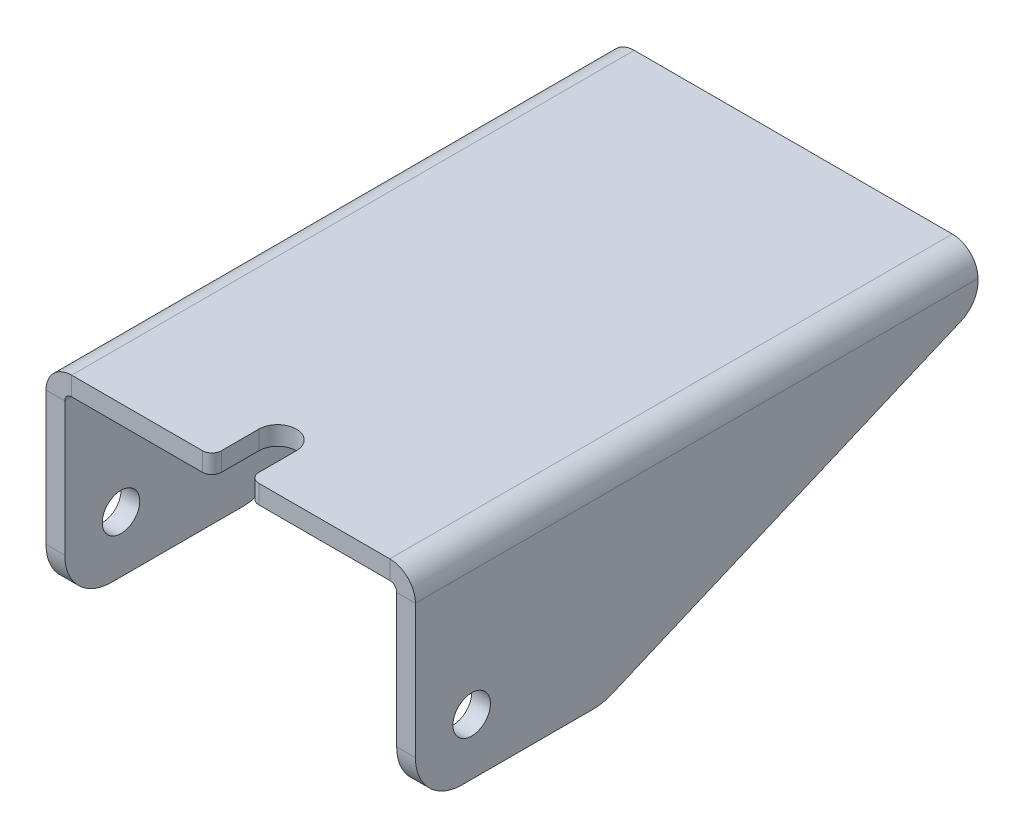
ISO-10303-21;
HEADER;
FILE_DESCRIPTION(('STEP AP214'),'2;1');
FILE_NAME('part.step','',(''),(''),'','','');
FILE_SCHEMA(('AUTOMOTIVE_DESIGN { 1 0 10303 214 1 1 1 1 }'));
ENDSEC;
DATA;
#1=APPLICATION_CONTEXT('core data for automotive mechanical design processes');
#2=APPLICATION_PROTOCOL_DEFINITION('international standard','automotive_design',2000,#1);
#3=PRODUCT_CONTEXT('',#1,'mechanical');
#4=PRODUCT('Part','Part','',(#3));
#5=PRODUCT_RELATED_PRODUCT_CATEGORY('part','',(#4));
#6=PRODUCT_DEFINITION_FORMATION('','',#4);
#7=PRODUCT_DEFINITION_CONTEXT('part definition',#1,'design');
#8=PRODUCT_DEFINITION('design','',#6,#7);
#9=PRODUCT_DEFINITION_SHAPE('','',#8);
#10=(LENGTH_UNIT() NAMED_UNIT(*) SI_UNIT(.MILLI.,.METRE.));
#11=(NAMED_UNIT(*) PLANE_ANGLE_UNIT() SI_UNIT($,.RADIAN.));
#12=(NAMED_UNIT(*) SI_UNIT($,.STERADIAN.) SOLID_ANGLE_UNIT());
#13=UNCERTAINTY_MEASURE_WITH_UNIT(LENGTH_MEASURE(1.E-05),#10,'distance_accuracy_value','');
#14=(GEOMETRIC_REPRESENTATION_CONTEXT(3) GLOBAL_UNCERTAINTY_ASSIGNED_CONTEXT((#13)) GLOBAL_UNIT_ASSIGNED_CONTEXT((#10,
#11,#12)) REPRESENTATION_CONTEXT('',''));
#15=CARTESIAN_POINT('',(0.,0.,0.));
#16=DIRECTION('',(0.,0.,1.));
#17=DIRECTION('',(1.,0.,0.));
#18=AXIS2_PLACEMENT_3D('',#15,#16,#17);
#19=CARTESIAN_POINT('',(-17.7,-2.,60.));
#20=DIRECTION('',(0.,0.,1.));
#21=DIRECTION('',(1.,0.,0.));
#22=AXIS2_PLACEMENT_3D('',#19,#20,#21);
#23=PLANE('',#22);
#24=DIRECTION('',(1.,0.,0.));
#25=VECTOR('',#24,1.);
#26=CARTESIAN_POINT('',(-17.7,0.,60.));
#27=LINE('',#26,#25);
#28=CARTESIAN_POINT('',(2.99999999999999,0.,60.));
#29=VERTEX_POINT('',#28);
#30=CARTESIAN_POINT('',(16.9634,0.,60.));
#31=VERTEX_POINT('',#30);
#32=EDGE_CURVE('E480',#29,#31,#27,.T.);
#33=ORIENTED_EDGE('',*,*,#32,.F.);
#34=DIRECTION('',(0.,1.,0.));
#35=VECTOR('',#34,1.);
#36=CARTESIAN_POINT('',(2.99999999999999,-2.,60.));
#37=LINE('',#36,#35);
#38=CARTESIAN_POINT('',(2.99999999999999,-2.,60.));
#39=VERTEX_POINT('',#38);
#40=EDGE_CURVE('E11',#29,#39,#37,.F.);
#41=ORIENTED_EDGE('',*,*,#40,.T.);
#42=DIRECTION('',(1.,0.,0.));
#43=VECTOR('',#42,1.);
#44=CARTESIAN_POINT('',(-17.7,-2.,60.));
#45=LINE('',#44,#43);
#46=CARTESIAN_POINT('',(16.9634,-2.,60.));
#47=VERTEX_POINT('',#46);
#48=EDGE_CURVE('E470',#39,#47,#45,.T.);
#49=ORIENTED_EDGE('',*,*,#48,.T.);
#50=DIRECTION('',(0.,1.,0.));
#51=VECTOR('',#50,1.);
#52=CARTESIAN_POINT('',(16.9634,-2.,60.));
#53=LINE('',#52,#51);
#54=EDGE_CURVE('E334',#47,#31,#53,.T.);
#55=ORIENTED_EDGE('',*,*,#54,.T.);
#56=EDGE_LOOP('',(#33,#41,#49,#55));
#57=FACE_BOUND('',#56,.T.);
#58=ADVANCED_FACE('F43',(#57),#23,.T.);
#59=CARTESIAN_POINT('',(-19.7000000000001,-22.,0.));
#60=DIRECTION('',(0.,0.,1.));
#61=DIRECTION('',(1.,0.,0.));
#62=AXIS2_PLACEMENT_3D('',#59,#60,#61);
#63=PLANE('',#62);
#64=DIRECTION('',(0.,-1.,0.));
#65=VECTOR('',#64,1.);
#66=CARTESIAN_POINT('',(-17.7000000000001,-22.,0.));
#67=LINE('',#66,#65);
#68=CARTESIAN_POINT('',(-17.7,-2.7366,0.));
#69=VERTEX_POINT('',#68);
#70=CARTESIAN_POINT('',(-17.7,-3.01530292818484,0.));
#71=VERTEX_POINT('',#70);
#72=EDGE_CURVE('E412',#69,#71,#67,.T.);
#73=ORIENTED_EDGE('',*,*,#72,.T.);
#74=DIRECTION('',(-1.,0.,0.));
#75=VECTOR('',#74,1.);
#76=CARTESIAN_POINT('',(-19.7,-3.01530292818483,0.));
#77=LINE('',#76,#75);
#78=CARTESIAN_POINT('',(-19.7,-3.01530292818483,0.));
#79=VERTEX_POINT('',#78);
#80=EDGE_CURVE('E509',#71,#79,#77,.T.);
#81=ORIENTED_EDGE('',*,*,#80,.T.);
#82=DIRECTION('',(0.,-1.,0.));
#83=VECTOR('',#82,1.);
#84=CARTESIAN_POINT('',(-19.7000000000001,-22.,0.));
#85=LINE('',#84,#83);
#86=CARTESIAN_POINT('',(-19.7,-2.73659999999999,0.));
#87=VERTEX_POINT('',#86);
#88=EDGE_CURVE('E413',#87,#79,#85,.T.);
#89=ORIENTED_EDGE('',*,*,#88,.F.);
#90=DIRECTION('',(-1.,0.,0.));
#91=VECTOR('',#90,1.);
#92=CARTESIAN_POINT('',(-17.7,-2.7366,0.));
#93=LINE('',#92,#91);
#94=EDGE_CURVE('E401',#69,#87,#93,.T.);
#95=ORIENTED_EDGE('',*,*,#94,.F.);
#96=EDGE_LOOP('',(#73,#81,#89,#95));
#97=FACE_BOUND('',#96,.T.);
#98=ADVANCED_FACE('F555',(#97),#63,.F.);
#99=CARTESIAN_POINT('',(-19.7,0.,0.));
#100=DIRECTION('',(1.,0.,0.));
#101=DIRECTION('',(0.,1.,0.));
#102=AXIS2_PLACEMENT_3D('',#99,#100,#101);
#103=PLANE('',#102);
#104=CARTESIAN_POINT('',(-19.7,-16.,54.));
#105=DIRECTION('',(-1.,0.,0.));
#106=DIRECTION('',(0.,-1.,0.));
#107=AXIS2_PLACEMENT_3D('',#104,#105,#106);
#108=CIRCLE('',#107,2.);
#109=CARTESIAN_POINT('',(-19.7000000000001,-18.,54.));
#110=VERTEX_POINT('',#109);
#111=EDGE_CURVE('E383',#110,#110,#108,.T.);
#112=ORIENTED_EDGE('',*,*,#111,.F.);
#113=EDGE_LOOP('',(#112));
#114=FACE_BOUND('',#113,.T.);
#115=ORIENTED_EDGE('',*,*,#88,.T.);
#116=CARTESIAN_POINT('',(-19.7,-3.01530292818483,3.));
#117=DIRECTION('',(1.,0.,0.));
#118=DIRECTION('',(0.,1.,0.));
#119=AXIS2_PLACEMENT_3D('',#116,#117,#118);
#120=CIRCLE('',#119,3.);
#121=CARTESIAN_POINT('',(-19.7,-5.77629568356025,1.82657807896545));
#122=VERTEX_POINT('',#121);
#123=EDGE_CURVE('E513',#79,#122,#120,.F.);
#124=ORIENTED_EDGE('',*,*,#123,.T.);
#125=DIRECTION('',(0.,-0.391140640344853,0.920330918458474));
#126=VECTOR('',#125,1.);
#127=CARTESIAN_POINT('',(-19.7,-4.99999999999993,0.));
#128=LINE('',#127,#126);
#129=CARTESIAN_POINT('',(-19.7000000000001,-21.6016545922924,39.0627166877468));
#130=VERTEX_POINT('',#129);
#131=EDGE_CURVE('E391',#122,#130,#128,.T.);
#132=ORIENTED_EDGE('',*,*,#131,.T.);
#133=CARTESIAN_POINT('',(-19.7000000000001,-17.,41.018419889471));
#134=DIRECTION('',(1.,0.,0.));
#135=DIRECTION('',(0.,1.,0.));
#136=AXIS2_PLACEMENT_3D('',#133,#134,#135);
#137=CIRCLE('',#136,5.);
#138=CARTESIAN_POINT('',(-19.7000000000001,-22.,41.018419889471));
#139=VERTEX_POINT('',#138);
#140=EDGE_CURVE('E489',#130,#139,#137,.F.);
#141=ORIENTED_EDGE('',*,*,#140,.T.);
#142=DIRECTION('',(0.,0.,1.));
#143=VECTOR('',#142,1.);
#144=CARTESIAN_POINT('',(-19.7000000000001,-22.,60.));
#145=LINE('',#144,#143);
#146=CARTESIAN_POINT('',(-19.7000000000001,-22.,55.));
#147=VERTEX_POINT('',#146);
#148=EDGE_CURVE('E417',#139,#147,#145,.T.);
#149=ORIENTED_EDGE('',*,*,#148,.T.);
#150=CARTESIAN_POINT('',(-19.7,-17.,55.));
#151=DIRECTION('',(1.,0.,0.));
#152=DIRECTION('',(0.,1.,0.));
#153=AXIS2_PLACEMENT_3D('',#150,#151,#152);
#154=CIRCLE('',#153,5.);
#155=CARTESIAN_POINT('',(-19.7,-17.,60.));
#156=VERTEX_POINT('',#155);
#157=EDGE_CURVE('E486',#147,#156,#154,.F.);
#158=ORIENTED_EDGE('',*,*,#157,.T.);
#159=DIRECTION('',(0.,1.,0.));
#160=VECTOR('',#159,1.);
#161=CARTESIAN_POINT('',(-19.7,-1.99999999999999,60.));
#162=LINE('',#161,#160);
#163=CARTESIAN_POINT('',(-19.7,-2.73659999999999,60.));
#164=VERTEX_POINT('',#163);
#165=EDGE_CURVE('E422',#156,#164,#162,.T.);
#166=ORIENTED_EDGE('',*,*,#165,.T.);
#167=DIRECTION('',(0.,0.,1.));
#168=VECTOR('',#167,1.);
#169=CARTESIAN_POINT('',(-19.7,-2.73659999999999,0.));
#170=LINE('',#169,#168);
#171=EDGE_CURVE('E405',#87,#164,#170,.T.);
#172=ORIENTED_EDGE('',*,*,#171,.F.);
#173=EDGE_LOOP('',(#115,#124,#132,#141,#149,#158,#166,#172));
#174=FACE_BOUND('',#173,.T.);
#175=ADVANCED_FACE('F561',(#114,#174),#103,.F.);
#176=CARTESIAN_POINT('',(-17.7,0.,0.));
#177=DIRECTION('',(1.,0.,0.));
#178=DIRECTION('',(0.,1.,0.));
#179=AXIS2_PLACEMENT_3D('',#176,#177,#178);
#180=PLANE('',#179);
#181=CARTESIAN_POINT('',(-17.7,-16.,54.));
#182=DIRECTION('',(1.,0.,0.));
#183=DIRECTION('',(0.,1.,0.));
#184=AXIS2_PLACEMENT_3D('',#181,#182,#183);
#185=CIRCLE('',#184,2.);
#186=CARTESIAN_POINT('',(-17.7,-14.,54.));
#187=VERTEX_POINT('',#186);
#188=EDGE_CURVE('E387',#187,#187,#185,.F.);
#189=ORIENTED_EDGE('',*,*,#188,.T.);
#190=EDGE_LOOP('',(#189));
#191=FACE_BOUND('',#190,.T.);
#192=DIRECTION('',(0.,-0.391140640344853,0.920330918458474));
#193=VECTOR('',#192,1.);
#194=CARTESIAN_POINT('',(-17.7,-4.99999999999994,0.));
#195=LINE('',#194,#193);
#196=CARTESIAN_POINT('',(-17.7,-5.77629568356026,1.82657807896545));
#197=VERTEX_POINT('',#196);
#198=CARTESIAN_POINT('',(-17.7000000000001,-21.6016545922924,39.0627166877468));
#199=VERTEX_POINT('',#198);
#200=EDGE_CURVE('E394',#197,#199,#195,.T.);
#201=ORIENTED_EDGE('',*,*,#200,.F.);
#202=CARTESIAN_POINT('',(-17.7,-3.01530292818484,3.));
#203=DIRECTION('',(1.,0.,0.));
#204=DIRECTION('',(0.,1.,0.));
#205=AXIS2_PLACEMENT_3D('',#202,#203,#204);
#206=CIRCLE('',#205,3.);
#207=EDGE_CURVE('E519',#197,#71,#206,.T.);
#208=ORIENTED_EDGE('',*,*,#207,.T.);
#209=ORIENTED_EDGE('',*,*,#72,.F.);
#210=DIRECTION('',(0.,0.,-1.));
#211=VECTOR('',#210,1.);
#212=CARTESIAN_POINT('',(-17.7,-2.7366,60.));
#213=LINE('',#212,#211);
#214=CARTESIAN_POINT('',(-17.7,-2.7366,60.));
#215=VERTEX_POINT('',#214);
#216=EDGE_CURVE('E398',#215,#69,#213,.T.);
#217=ORIENTED_EDGE('',*,*,#216,.F.);
#218=DIRECTION('',(0.,1.,0.));
#219=VECTOR('',#218,1.);
#220=CARTESIAN_POINT('',(-17.7,-2.,60.));
#221=LINE('',#220,#219);
#222=CARTESIAN_POINT('',(-17.7,-17.,60.));
#223=VERTEX_POINT('',#222);
#224=EDGE_CURVE('E418',#223,#215,#221,.T.);
#225=ORIENTED_EDGE('',*,*,#224,.F.);
#226=CARTESIAN_POINT('',(-17.7,-17.,55.));
#227=DIRECTION('',(1.,0.,0.));
#228=DIRECTION('',(0.,1.,0.));
#229=AXIS2_PLACEMENT_3D('',#226,#227,#228);
#230=CIRCLE('',#229,5.);
#231=CARTESIAN_POINT('',(-17.7000000000001,-22.,55.));
#232=VERTEX_POINT('',#231);
#233=EDGE_CURVE('E498',#223,#232,#230,.T.);
#234=ORIENTED_EDGE('',*,*,#233,.T.);
#235=DIRECTION('',(0.,0.,1.));
#236=VECTOR('',#235,1.);
#237=CARTESIAN_POINT('',(-17.7000000000001,-22.,60.));
#238=LINE('',#237,#236);
#239=CARTESIAN_POINT('',(-17.7000000000001,-22.,41.018419889471));
#240=VERTEX_POINT('',#239);
#241=EDGE_CURVE('E429',#240,#232,#238,.T.);
#242=ORIENTED_EDGE('',*,*,#241,.F.);
#243=CARTESIAN_POINT('',(-17.7,-17.,41.018419889471));
#244=DIRECTION('',(1.,0.,0.));
#245=DIRECTION('',(0.,1.,0.));
#246=AXIS2_PLACEMENT_3D('',#243,#244,#245);
#247=CIRCLE('',#246,5.);
#248=EDGE_CURVE('E501',#240,#199,#247,.T.);
#249=ORIENTED_EDGE('',*,*,#248,.T.);
#250=EDGE_LOOP('',(#201,#208,#209,#217,#225,#234,#242,#249));
#251=FACE_BOUND('',#250,.T.);
#252=ADVANCED_FACE('F628',(#191,#251),#180,.T.);
#253=CARTESIAN_POINT('',(-19.7000000000001,-22.,60.));
#254=DIRECTION('',(0.,1.,0.));
#255=DIRECTION('',(-1.,0.,0.));
#256=AXIS2_PLACEMENT_3D('',#253,#254,#255);
#257=PLANE('',#256);
#258=ORIENTED_EDGE('',*,*,#148,.F.);
#259=DIRECTION('',(-1.,0.,0.));
#260=VECTOR('',#259,1.);
#261=CARTESIAN_POINT('',(-17.7,-22.,41.018419889471));
#262=LINE('',#261,#260);
#263=EDGE_CURVE('E495',#139,#240,#262,.F.);
#264=ORIENTED_EDGE('',*,*,#263,.T.);
#265=ORIENTED_EDGE('',*,*,#241,.T.);
#266=DIRECTION('',(1.,0.,0.));
#267=VECTOR('',#266,1.);
#268=CARTESIAN_POINT('',(-19.7000000000001,-22.,55.));
#269=LINE('',#268,#267);
#270=EDGE_CURVE('E492',#232,#147,#269,.F.);
#271=ORIENTED_EDGE('',*,*,#270,.T.);
#272=EDGE_LOOP('',(#258,#264,#265,#271));
#273=FACE_BOUND('',#272,.T.);
#274=ADVANCED_FACE('F649',(#273),#257,.F.);
#275=CARTESIAN_POINT('',(0.,-2.,0.));
#276=DIRECTION('',(0.,0.,-1.));
#277=DIRECTION('',(-1.,0.,0.));
#278=AXIS2_PLACEMENT_3D('',#275,#276,#277);
#279=PLANE('',#278);
#280=DIRECTION('',(-1.,0.,0.));
#281=VECTOR('',#280,1.);
#282=CARTESIAN_POINT('',(0.,-2.,0.));
#283=LINE('',#282,#281);
#284=CARTESIAN_POINT('',(16.9634,-2.,0.));
#285=VERTEX_POINT('',#284);
#286=CARTESIAN_POINT('',(-16.9634,-2.,0.));
#287=VERTEX_POINT('',#286);
#288=EDGE_CURVE('E466',#285,#287,#283,.T.);
#289=ORIENTED_EDGE('',*,*,#288,.T.);
#290=DIRECTION('',(0.,1.,0.));
#291=VECTOR('',#290,1.);
#292=CARTESIAN_POINT('',(-16.9634,-2.,0.));
#293=LINE('',#292,#291);
#294=CARTESIAN_POINT('',(-16.9634,0.,0.));
#295=VERTEX_POINT('',#294);
#296=EDGE_CURVE('E444',#287,#295,#293,.T.);
#297=ORIENTED_EDGE('',*,*,#296,.T.);
#298=DIRECTION('',(-1.,0.,0.));
#299=VECTOR('',#298,1.);
#300=CARTESIAN_POINT('',(0.,0.,0.));
#301=LINE('',#300,#299);
#302=CARTESIAN_POINT('',(16.9634,0.,0.));
#303=VERTEX_POINT('',#302);
#304=EDGE_CURVE('E462',#303,#295,#301,.T.);
#305=ORIENTED_EDGE('',*,*,#304,.F.);
#306=DIRECTION('',(0.,1.,0.));
#307=VECTOR('',#306,1.);
#308=CARTESIAN_POINT('',(16.9634,-2.,0.));
#309=LINE('',#308,#307);
#310=EDGE_CURVE('E320',#285,#303,#309,.T.);
#311=ORIENTED_EDGE('',*,*,#310,.F.);
#312=EDGE_LOOP('',(#289,#297,#305,#311));
#313=FACE_BOUND('',#312,.T.);
#314=ADVANCED_FACE('F616',(#313),#279,.T.);
#315=CARTESIAN_POINT('',(0.,-2.,0.));
#316=DIRECTION('',(0.,1.,0.));
#317=DIRECTION('',(0.,0.,1.));
#318=AXIS2_PLACEMENT_3D('',#315,#316,#317);
#319=PLANE('',#318);
#320=DIRECTION('',(0.,0.,-1.));
#321=VECTOR('',#320,1.);
#322=CARTESIAN_POINT('',(-1.99999999999999,-2.,55.));
#323=LINE('',#322,#321);
#324=CARTESIAN_POINT('',(-1.99999999999999,-2.,59.));
#325=VERTEX_POINT('',#324);
#326=CARTESIAN_POINT('',(-1.99999999999999,-2.,55.));
#327=VERTEX_POINT('',#326);
#328=EDGE_CURVE('E224',#325,#327,#323,.T.);
#329=ORIENTED_EDGE('',*,*,#328,.F.);
#330=CARTESIAN_POINT('',(-2.99999999999999,-2.,59.));
#331=DIRECTION('',(0.,1.,0.));
#332=DIRECTION('',(0.,0.,1.));
#333=AXIS2_PLACEMENT_3D('',#330,#331,#332);
#334=CIRCLE('',#333,1.);
#335=CARTESIAN_POINT('',(-2.99999999999999,-2.,60.));
#336=VERTEX_POINT('',#335);
#337=EDGE_CURVE('E536',#325,#336,#334,.F.);
#338=ORIENTED_EDGE('',*,*,#337,.T.);
#339=CARTESIAN_POINT('',(-16.9634,-2.,60.));
#340=VERTEX_POINT('',#339);
#341=EDGE_CURVE('E472',#340,#336,#45,.T.);
#342=ORIENTED_EDGE('',*,*,#341,.F.);
#343=DIRECTION('',(0.,0.,-1.));
#344=VECTOR('',#343,1.);
#345=CARTESIAN_POINT('',(-16.9634,-2.,0.));
#346=LINE('',#345,#344);
#347=EDGE_CURVE('E452',#287,#340,#346,.F.);
#348=ORIENTED_EDGE('',*,*,#347,.F.);
#349=ORIENTED_EDGE('',*,*,#288,.F.);
#350=DIRECTION('',(0.,0.,-1.));
#351=VECTOR('',#350,1.);
#352=CARTESIAN_POINT('',(16.9634,-2.,0.));
#353=LINE('',#352,#351);
#354=EDGE_CURVE('E327',#285,#47,#353,.F.);
#355=ORIENTED_EDGE('',*,*,#354,.T.);
#356=ORIENTED_EDGE('',*,*,#48,.F.);
#357=CARTESIAN_POINT('',(2.99999999999999,-2.,59.));
#358=DIRECTION('',(0.,1.,0.));
#359=DIRECTION('',(0.,0.,1.));
#360=AXIS2_PLACEMENT_3D('',#357,#358,#359);
#361=CIRCLE('',#360,1.);
#362=CARTESIAN_POINT('',(1.99999999999999,-2.,59.));
#363=VERTEX_POINT('',#362);
#364=EDGE_CURVE('E59',#39,#363,#361,.F.);
#365=ORIENTED_EDGE('',*,*,#364,.T.);
#366=DIRECTION('',(0.,0.,1.));
#367=VECTOR('',#366,1.);
#368=CARTESIAN_POINT('',(1.99999999999999,-2.,55.));
#369=LINE('',#368,#367);
#370=CARTESIAN_POINT('',(1.99999999999999,-2.,55.));
#371=VERTEX_POINT('',#370);
#372=EDGE_CURVE('E250',#371,#363,#369,.T.);
#373=ORIENTED_EDGE('',*,*,#372,.F.);
#374=CARTESIAN_POINT('',(0.,-2.,55.));
#375=DIRECTION('',(0.,1.,0.));
#376=DIRECTION('',(0.,0.,1.));
#377=AXIS2_PLACEMENT_3D('',#374,#375,#376);
#378=CIRCLE('',#377,1.99999999999999);
#379=EDGE_CURVE('E255',#327,#371,#378,.F.);
#380=ORIENTED_EDGE('',*,*,#379,.F.);
#381=EDGE_LOOP('',(#329,#338,#342,#348,#349,#355,#356,#365,#373,#380));
#382=FACE_BOUND('',#381,.T.);
#383=ADVANCED_FACE('F576',(#382),#319,.F.);
#384=CARTESIAN_POINT('',(0.,0.,0.));
#385=DIRECTION('',(0.,1.,0.));
#386=DIRECTION('',(0.,0.,1.));
#387=AXIS2_PLACEMENT_3D('',#384,#385,#386);
#388=PLANE('',#387);
#389=CARTESIAN_POINT('',(-16.9634,0.,60.));
#390=VERTEX_POINT('',#389);
#391=CARTESIAN_POINT('',(-2.99999999999999,0.,60.));
#392=VERTEX_POINT('',#391);
#393=EDGE_CURVE('E471',#390,#392,#27,.T.);
#394=ORIENTED_EDGE('',*,*,#393,.T.);
#395=CARTESIAN_POINT('',(-2.99999999999999,0.,59.));
#396=DIRECTION('',(0.,1.,0.));
#397=DIRECTION('',(0.,0.,1.));
#398=AXIS2_PLACEMENT_3D('',#395,#396,#397);
#399=CIRCLE('',#398,1.);
#400=CARTESIAN_POINT('',(-1.99999999999999,0.,59.));
#401=VERTEX_POINT('',#400);
#402=EDGE_CURVE('E242',#392,#401,#399,.T.);
#403=ORIENTED_EDGE('',*,*,#402,.T.);
#404=DIRECTION('',(0.,0.,1.));
#405=VECTOR('',#404,1.);
#406=CARTESIAN_POINT('',(-1.99999999999999,0.,55.));
#407=LINE('',#406,#405);
#408=CARTESIAN_POINT('',(-1.99999999999999,0.,55.));
#409=VERTEX_POINT('',#408);
#410=EDGE_CURVE('E221',#409,#401,#407,.T.);
#411=ORIENTED_EDGE('',*,*,#410,.F.);
#412=CARTESIAN_POINT('',(0.,0.,55.));
#413=DIRECTION('',(0.,1.,0.));
#414=DIRECTION('',(0.,0.,1.));
#415=AXIS2_PLACEMENT_3D('',#412,#413,#414);
#416=CIRCLE('',#415,1.99999999999999);
#417=CARTESIAN_POINT('',(1.99999999999999,0.,55.));
#418=VERTEX_POINT('',#417);
#419=EDGE_CURVE('E233',#418,#409,#416,.T.);
#420=ORIENTED_EDGE('',*,*,#419,.F.);
#421=DIRECTION('',(0.,0.,-1.));
#422=VECTOR('',#421,1.);
#423=CARTESIAN_POINT('',(1.99999999999999,0.,55.));
#424=LINE('',#423,#422);
#425=CARTESIAN_POINT('',(1.99999999999999,0.,59.));
#426=VERTEX_POINT('',#425);
#427=EDGE_CURVE('E229',#426,#418,#424,.T.);
#428=ORIENTED_EDGE('',*,*,#427,.F.);
#429=CARTESIAN_POINT('',(2.99999999999999,0.,59.));
#430=DIRECTION('',(0.,1.,0.));
#431=DIRECTION('',(0.,0.,1.));
#432=AXIS2_PLACEMENT_3D('',#429,#430,#431);
#433=CIRCLE('',#432,1.);
#434=EDGE_CURVE('E526',#426,#29,#433,.T.);
#435=ORIENTED_EDGE('',*,*,#434,.T.);
#436=ORIENTED_EDGE('',*,*,#32,.T.);
#437=DIRECTION('',(0.,0.,-1.));
#438=VECTOR('',#437,1.);
#439=CARTESIAN_POINT('',(16.9634,0.,0.));
#440=LINE('',#439,#438);
#441=EDGE_CURVE('E312',#303,#31,#440,.F.);
#442=ORIENTED_EDGE('',*,*,#441,.F.);
#443=ORIENTED_EDGE('',*,*,#304,.T.);
#444=DIRECTION('',(0.,0.,-1.));
#445=VECTOR('',#444,1.);
#446=CARTESIAN_POINT('',(-16.9634,0.,0.));
#447=LINE('',#446,#445);
#448=EDGE_CURVE('E435',#295,#390,#447,.F.);
#449=ORIENTED_EDGE('',*,*,#448,.T.);
#450=EDGE_LOOP('',(#394,#403,#411,#420,#428,#435,#436,#442,#443,#449));
#451=FACE_BOUND('',#450,.T.);
#452=ADVANCED_FACE('F241',(#451),#388,.T.);
#453=ORIENTED_EDGE('',*,*,#341,.T.);
#454=DIRECTION('',(0.,1.,0.));
#455=VECTOR('',#454,1.);
#456=CARTESIAN_POINT('',(-2.99999999999999,0.,60.));
#457=LINE('',#456,#455);
#458=EDGE_CURVE('E522',#336,#392,#457,.T.);
#459=ORIENTED_EDGE('',*,*,#458,.T.);
#460=ORIENTED_EDGE('',*,*,#393,.F.);
#461=DIRECTION('',(0.,1.,0.));
#462=VECTOR('',#461,1.);
#463=CARTESIAN_POINT('',(-16.9634,-2.,60.));
#464=LINE('',#463,#462);
#465=EDGE_CURVE('E458',#340,#390,#464,.T.);
#466=ORIENTED_EDGE('',*,*,#465,.F.);
#467=EDGE_LOOP('',(#453,#459,#460,#466));
#468=FACE_BOUND('',#467,.T.);
#469=ADVANCED_FACE('F557',(#468),#23,.T.);
#470=CARTESIAN_POINT('',(-16.9634,-2.7366,60.));
#471=DIRECTION('',(0.,0.,1.));
#472=DIRECTION('',(1.,0.,0.));
#473=AXIS2_PLACEMENT_3D('',#470,#471,#472);
#474=PLANE('',#473);
#475=DIRECTION('',(-1.,0.,0.));
#476=VECTOR('',#475,1.);
#477=CARTESIAN_POINT('',(-17.7,-2.7366,60.));
#478=LINE('',#477,#476);
#479=EDGE_CURVE('E397',#215,#164,#478,.T.);
#480=ORIENTED_EDGE('',*,*,#479,.F.);
#481=CARTESIAN_POINT('',(-16.9634,-2.7366,60.));
#482=DIRECTION('',(0.,0.,-1.));
#483=DIRECTION('',(-1.,0.,0.));
#484=AXIS2_PLACEMENT_3D('',#481,#482,#483);
#485=CIRCLE('',#484,0.7366);
#486=EDGE_CURVE('E448',#340,#215,#485,.F.);
#487=ORIENTED_EDGE('',*,*,#486,.F.);
#488=ORIENTED_EDGE('',*,*,#465,.T.);
#489=CARTESIAN_POINT('',(-16.9634,-2.7366,60.));
#490=DIRECTION('',(0.,0.,-1.));
#491=DIRECTION('',(-1.,0.,0.));
#492=AXIS2_PLACEMENT_3D('',#489,#490,#491);
#493=CIRCLE('',#492,2.7366);
#494=EDGE_CURVE('E439',#390,#164,#493,.F.);
#495=ORIENTED_EDGE('',*,*,#494,.T.);
#496=EDGE_LOOP('',(#480,#487,#488,#495));
#497=FACE_BOUND('',#496,.T.);
#498=ADVANCED_FACE('F567',(#497),#474,.T.);
#499=CARTESIAN_POINT('',(-16.9634,-2.7366,0.));
#500=DIRECTION('',(0.,0.,1.));
#501=DIRECTION('',(1.,0.,0.));
#502=AXIS2_PLACEMENT_3D('',#499,#500,#501);
#503=PLANE('',#502);
#504=CARTESIAN_POINT('',(-16.9634,-2.7366,0.));
#505=DIRECTION('',(0.,0.,-1.));
#506=DIRECTION('',(-1.,0.,0.));
#507=AXIS2_PLACEMENT_3D('',#504,#505,#506);
#508=CIRCLE('',#507,0.7366);
#509=EDGE_CURVE('E425',#69,#287,#508,.T.);
#510=ORIENTED_EDGE('',*,*,#509,.F.);
#511=ORIENTED_EDGE('',*,*,#94,.T.);
#512=CARTESIAN_POINT('',(-16.9634,-2.7366,0.));
#513=DIRECTION('',(0.,0.,-1.));
#514=DIRECTION('',(-1.,0.,0.));
#515=AXIS2_PLACEMENT_3D('',#512,#513,#514);
#516=CIRCLE('',#515,2.7366);
#517=EDGE_CURVE('E440',#87,#295,#516,.T.);
#518=ORIENTED_EDGE('',*,*,#517,.T.);
#519=ORIENTED_EDGE('',*,*,#296,.F.);
#520=EDGE_LOOP('',(#510,#511,#518,#519));
#521=FACE_BOUND('',#520,.T.);
#522=ADVANCED_FACE('F573',(#521),#503,.F.);
#523=CARTESIAN_POINT('',(-16.9634,-2.7366,0.));
#524=DIRECTION('',(0.,0.,-1.));
#525=DIRECTION('',(-1.,0.,0.));
#526=AXIS2_PLACEMENT_3D('',#523,#524,#525);
#527=CYLINDRICAL_SURFACE('',#526,2.7366);
#528=ORIENTED_EDGE('',*,*,#448,.F.);
#529=ORIENTED_EDGE('',*,*,#517,.F.);
#530=ORIENTED_EDGE('',*,*,#171,.T.);
#531=ORIENTED_EDGE('',*,*,#494,.F.);
#532=EDGE_LOOP('',(#528,#529,#530,#531));
#533=FACE_BOUND('',#532,.T.);
#534=ADVANCED_FACE('F660',(#533),#527,.T.);
#535=CARTESIAN_POINT('',(-16.9634,-2.7366,0.));
#536=DIRECTION('',(0.,0.,-1.));
#537=DIRECTION('',(-1.,0.,0.));
#538=AXIS2_PLACEMENT_3D('',#535,#536,#537);
#539=CYLINDRICAL_SURFACE('',#538,0.7366);
#540=ORIENTED_EDGE('',*,*,#347,.T.);
#541=ORIENTED_EDGE('',*,*,#486,.T.);
#542=ORIENTED_EDGE('',*,*,#216,.T.);
#543=ORIENTED_EDGE('',*,*,#509,.T.);
#544=EDGE_LOOP('',(#540,#541,#542,#543));
#545=FACE_BOUND('',#544,.T.);
#546=ADVANCED_FACE('F621',(#545),#539,.F.);
#547=CARTESIAN_POINT('',(-19.7,-1.99999999999999,60.));
#548=DIRECTION('',(0.,0.,-1.));
#549=DIRECTION('',(-1.,0.,0.));
#550=AXIS2_PLACEMENT_3D('',#547,#548,#549);
#551=PLANE('',#550);
#552=ORIENTED_EDGE('',*,*,#165,.F.);
#553=DIRECTION('',(1.,0.,0.));
#554=VECTOR('',#553,1.);
#555=CARTESIAN_POINT('',(-19.7,-17.,60.));
#556=LINE('',#555,#554);
#557=EDGE_CURVE('E505',#156,#223,#556,.T.);
#558=ORIENTED_EDGE('',*,*,#557,.T.);
#559=ORIENTED_EDGE('',*,*,#224,.T.);
#560=ORIENTED_EDGE('',*,*,#479,.T.);
#561=EDGE_LOOP('',(#552,#558,#559,#560));
#562=FACE_BOUND('',#561,.T.);
#563=ADVANCED_FACE('F657',(#562),#551,.F.);
#564=CARTESIAN_POINT('',(25.7626276242015,-5.00000000000009,0.));
#565=DIRECTION('',(0.,-0.920330918458474,-0.391140640344853));
#566=DIRECTION('',(0.,0.391140640344853,-0.920330918458474));
#567=AXIS2_PLACEMENT_3D('',#564,#565,#566);
#568=PLANE('',#567);
#569=ORIENTED_EDGE('',*,*,#131,.F.);
#570=DIRECTION('',(-1.,0.,0.));
#571=VECTOR('',#570,1.);
#572=CARTESIAN_POINT('',(-17.7,-5.77629568356026,1.82657807896544));
#573=LINE('',#572,#571);
#574=EDGE_CURVE('E516',#122,#197,#573,.F.);
#575=ORIENTED_EDGE('',*,*,#574,.T.);
#576=ORIENTED_EDGE('',*,*,#200,.T.);
#577=DIRECTION('',(-1.,0.,0.));
#578=VECTOR('',#577,1.);
#579=CARTESIAN_POINT('',(-19.7,-21.6016545922924,39.0627166877467));
#580=LINE('',#579,#578);
#581=EDGE_CURVE('E476',#199,#130,#580,.T.);
#582=ORIENTED_EDGE('',*,*,#581,.T.);
#583=EDGE_LOOP('',(#569,#575,#576,#582));
#584=FACE_BOUND('',#583,.T.);
#585=ADVANCED_FACE('F640',(#584),#568,.T.);
#586=CARTESIAN_POINT('',(25.7626276242014,-17.0000000000002,41.018419889471));
#587=DIRECTION('',(1.,0.,0.));
#588=DIRECTION('',(0.,1.,0.));
#589=AXIS2_PLACEMENT_3D('',#586,#587,#588);
#590=CYLINDRICAL_SURFACE('',#589,5.);
#591=ORIENTED_EDGE('',*,*,#248,.F.);
#592=ORIENTED_EDGE('',*,*,#263,.F.);
#593=ORIENTED_EDGE('',*,*,#140,.F.);
#594=ORIENTED_EDGE('',*,*,#581,.F.);
#595=EDGE_LOOP('',(#591,#592,#593,#594));
#596=FACE_BOUND('',#595,.T.);
#597=ADVANCED_FACE('F644',(#596),#590,.T.);
#598=CARTESIAN_POINT('',(-19.7,-17.,55.));
#599=DIRECTION('',(1.,0.,0.));
#600=DIRECTION('',(0.,1.,0.));
#601=AXIS2_PLACEMENT_3D('',#598,#599,#600);
#602=CYLINDRICAL_SURFACE('',#601,5.);
#603=ORIENTED_EDGE('',*,*,#157,.F.);
#604=ORIENTED_EDGE('',*,*,#270,.F.);
#605=ORIENTED_EDGE('',*,*,#233,.F.);
#606=ORIENTED_EDGE('',*,*,#557,.F.);
#607=EDGE_LOOP('',(#603,#604,#605,#606));
#608=FACE_BOUND('',#607,.T.);
#609=ADVANCED_FACE('F653',(#608),#602,.T.);
#610=CARTESIAN_POINT('',(-19.7,-3.01530292818483,3.));
#611=DIRECTION('',(1.,0.,0.));
#612=DIRECTION('',(0.,1.,0.));
#613=AXIS2_PLACEMENT_3D('',#610,#611,#612);
#614=CYLINDRICAL_SURFACE('',#613,3.);
#615=ORIENTED_EDGE('',*,*,#207,.F.);
#616=ORIENTED_EDGE('',*,*,#574,.F.);
#617=ORIENTED_EDGE('',*,*,#123,.F.);
#618=ORIENTED_EDGE('',*,*,#80,.F.);
#619=EDGE_LOOP('',(#615,#616,#617,#618));
#620=FACE_BOUND('',#619,.T.);
#621=ADVANCED_FACE('F633',(#620),#614,.T.);
#622=CARTESIAN_POINT('',(-12.0431457505077,-16.,54.));
#623=DIRECTION('',(-1.,0.,0.));
#624=DIRECTION('',(0.,-1.,0.));
#625=AXIS2_PLACEMENT_3D('',#622,#623,#624);
#626=CYLINDRICAL_SURFACE('',#625,2.);
#627=ORIENTED_EDGE('',*,*,#111,.T.);
#628=EDGE_LOOP('',(#627));
#629=FACE_BOUND('',#628,.T.);
#630=ORIENTED_EDGE('',*,*,#188,.F.);
#631=EDGE_LOOP('',(#630));
#632=FACE_BOUND('',#631,.T.);
#633=ADVANCED_FACE('F684',(#629,#632),#626,.F.);
#634=CARTESIAN_POINT('',(19.7000000000001,-22.,0.));
#635=DIRECTION('',(0.,0.,1.));
#636=DIRECTION('',(-1.,0.,0.));
#637=AXIS2_PLACEMENT_3D('',#634,#635,#636);
#638=PLANE('',#637);
#639=DIRECTION('',(0.,-1.,0.));
#640=VECTOR('',#639,1.);
#641=CARTESIAN_POINT('',(17.7000000000001,-22.,0.));
#642=LINE('',#641,#640);
#643=CARTESIAN_POINT('',(17.7,-2.7366,0.));
#644=VERTEX_POINT('',#643);
#645=CARTESIAN_POINT('',(17.7,-3.01530292818484,0.));
#646=VERTEX_POINT('',#645);
#647=EDGE_CURVE('E287',#644,#646,#642,.T.);
#648=ORIENTED_EDGE('',*,*,#647,.F.);
#649=DIRECTION('',(1.,0.,0.));
#650=VECTOR('',#649,1.);
#651=CARTESIAN_POINT('',(17.7,-2.7366,0.));
#652=LINE('',#651,#650);
#653=CARTESIAN_POINT('',(19.7,-2.73659999999999,0.));
#654=VERTEX_POINT('',#653);
#655=EDGE_CURVE('E276',#644,#654,#652,.T.);
#656=ORIENTED_EDGE('',*,*,#655,.T.);
#657=DIRECTION('',(0.,-1.,0.));
#658=VECTOR('',#657,1.);
#659=CARTESIAN_POINT('',(19.7000000000001,-22.,0.));
#660=LINE('',#659,#658);
#661=CARTESIAN_POINT('',(19.7,-3.01530292818483,0.));
#662=VERTEX_POINT('',#661);
#663=EDGE_CURVE('E288',#654,#662,#660,.T.);
#664=ORIENTED_EDGE('',*,*,#663,.T.);
#665=DIRECTION('',(1.,0.,0.));
#666=VECTOR('',#665,1.);
#667=CARTESIAN_POINT('',(19.7,-3.01530292818483,0.));
#668=LINE('',#667,#666);
#669=EDGE_CURVE('E369',#646,#662,#668,.T.);
#670=ORIENTED_EDGE('',*,*,#669,.F.);
#671=EDGE_LOOP('',(#648,#656,#664,#670));
#672=FACE_BOUND('',#671,.T.);
#673=ADVANCED_FACE('F688',(#672),#638,.F.);
#674=CARTESIAN_POINT('',(19.7,0.,0.));
#675=DIRECTION('',(-1.,0.,0.));
#676=DIRECTION('',(0.,1.,0.));
#677=AXIS2_PLACEMENT_3D('',#674,#675,#676);
#678=PLANE('',#677);
#679=CARTESIAN_POINT('',(19.7,-16.,54.));
#680=DIRECTION('',(-1.,0.,0.));
#681=DIRECTION('',(0.,-1.,0.));
#682=AXIS2_PLACEMENT_3D('',#679,#680,#681);
#683=CIRCLE('',#682,2.);
#684=CARTESIAN_POINT('',(19.7000000000001,-18.,54.));
#685=VERTEX_POINT('',#684);
#686=EDGE_CURVE('E254',#685,#685,#683,.T.);
#687=ORIENTED_EDGE('',*,*,#686,.T.);
#688=EDGE_LOOP('',(#687));
#689=FACE_BOUND('',#688,.T.);
#690=ORIENTED_EDGE('',*,*,#663,.F.);
#691=DIRECTION('',(0.,0.,1.));
#692=VECTOR('',#691,1.);
#693=CARTESIAN_POINT('',(19.7,-2.73659999999999,0.));
#694=LINE('',#693,#692);
#695=CARTESIAN_POINT('',(19.7,-2.73659999999999,60.));
#696=VERTEX_POINT('',#695);
#697=EDGE_CURVE('E280',#654,#696,#694,.T.);
#698=ORIENTED_EDGE('',*,*,#697,.T.);
#699=DIRECTION('',(0.,1.,0.));
#700=VECTOR('',#699,1.);
#701=CARTESIAN_POINT('',(19.7,-1.99999999999999,60.));
#702=LINE('',#701,#700);
#703=CARTESIAN_POINT('',(19.7,-17.,60.));
#704=VERTEX_POINT('',#703);
#705=EDGE_CURVE('E297',#704,#696,#702,.T.);
#706=ORIENTED_EDGE('',*,*,#705,.F.);
#707=CARTESIAN_POINT('',(19.7,-17.,55.));
#708=DIRECTION('',(1.,0.,0.));
#709=DIRECTION('',(0.,1.,0.));
#710=AXIS2_PLACEMENT_3D('',#707,#708,#709);
#711=CIRCLE('',#710,5.);
#712=CARTESIAN_POINT('',(19.7000000000001,-22.,55.));
#713=VERTEX_POINT('',#712);
#714=EDGE_CURVE('E344',#713,#704,#711,.F.);
#715=ORIENTED_EDGE('',*,*,#714,.F.);
#716=DIRECTION('',(0.,0.,1.));
#717=VECTOR('',#716,1.);
#718=CARTESIAN_POINT('',(19.7000000000001,-22.,60.));
#719=LINE('',#718,#717);
#720=CARTESIAN_POINT('',(19.7000000000001,-22.,41.018419889471));
#721=VERTEX_POINT('',#720);
#722=EDGE_CURVE('E292',#721,#713,#719,.T.);
#723=ORIENTED_EDGE('',*,*,#722,.F.);
#724=CARTESIAN_POINT('',(19.7000000000001,-17.,41.018419889471));
#725=DIRECTION('',(1.,0.,0.));
#726=DIRECTION('',(0.,1.,0.));
#727=AXIS2_PLACEMENT_3D('',#724,#725,#726);
#728=CIRCLE('',#727,5.);
#729=CARTESIAN_POINT('',(19.7000000000001,-21.6016545922924,39.0627166877468));
#730=VERTEX_POINT('',#729);
#731=EDGE_CURVE('E348',#730,#721,#728,.F.);
#732=ORIENTED_EDGE('',*,*,#731,.F.);
#733=DIRECTION('',(0.,-0.391140640344853,0.920330918458474));
#734=VECTOR('',#733,1.);
#735=CARTESIAN_POINT('',(19.7,-4.99999999999993,0.));
#736=LINE('',#735,#734);
#737=CARTESIAN_POINT('',(19.7,-5.77629568356025,1.82657807896545));
#738=VERTEX_POINT('',#737);
#739=EDGE_CURVE('E263',#738,#730,#736,.T.);
#740=ORIENTED_EDGE('',*,*,#739,.F.);
#741=CARTESIAN_POINT('',(19.7,-3.01530292818483,3.));
#742=DIRECTION('',(1.,0.,0.));
#743=DIRECTION('',(0.,1.,0.));
#744=AXIS2_PLACEMENT_3D('',#741,#742,#743);
#745=CIRCLE('',#744,3.);
#746=EDGE_CURVE('E373',#662,#738,#745,.F.);
#747=ORIENTED_EDGE('',*,*,#746,.F.);
#748=EDGE_LOOP('',(#690,#698,#706,#715,#723,#732,#740,#747));
#749=FACE_BOUND('',#748,.T.);
#750=ADVANCED_FACE('F613',(#689,#749),#678,.F.);
#751=CARTESIAN_POINT('',(17.7,0.,0.));
#752=DIRECTION('',(-1.,0.,0.));
#753=DIRECTION('',(0.,1.,0.));
#754=AXIS2_PLACEMENT_3D('',#751,#752,#753);
#755=PLANE('',#754);
#756=CARTESIAN_POINT('',(17.7,-16.,54.));
#757=DIRECTION('',(1.,0.,0.));
#758=DIRECTION('',(0.,1.,0.));
#759=AXIS2_PLACEMENT_3D('',#756,#757,#758);
#760=CIRCLE('',#759,2.);
#761=CARTESIAN_POINT('',(17.7,-14.,54.));
#762=VERTEX_POINT('',#761);
#763=EDGE_CURVE('E259',#762,#762,#760,.F.);
#764=ORIENTED_EDGE('',*,*,#763,.F.);
#765=EDGE_LOOP('',(#764));
#766=FACE_BOUND('',#765,.T.);
#767=DIRECTION('',(0.,-0.391140640344853,0.920330918458474));
#768=VECTOR('',#767,1.);
#769=CARTESIAN_POINT('',(17.7,-4.99999999999994,0.));
#770=LINE('',#769,#768);
#771=CARTESIAN_POINT('',(17.7,-5.77629568356026,1.82657807896545));
#772=VERTEX_POINT('',#771);
#773=CARTESIAN_POINT('',(17.7000000000001,-21.6016545922924,39.0627166877468));
#774=VERTEX_POINT('',#773);
#775=EDGE_CURVE('E267',#772,#774,#770,.T.);
#776=ORIENTED_EDGE('',*,*,#775,.T.);
#777=CARTESIAN_POINT('',(17.7,-17.,41.018419889471));
#778=DIRECTION('',(1.,0.,0.));
#779=DIRECTION('',(0.,1.,0.));
#780=AXIS2_PLACEMENT_3D('',#777,#778,#779);
#781=CIRCLE('',#780,5.);
#782=CARTESIAN_POINT('',(17.7000000000001,-22.,41.018419889471));
#783=VERTEX_POINT('',#782);
#784=EDGE_CURVE('E362',#783,#774,#781,.T.);
#785=ORIENTED_EDGE('',*,*,#784,.F.);
#786=DIRECTION('',(0.,0.,1.));
#787=VECTOR('',#786,1.);
#788=CARTESIAN_POINT('',(17.7000000000001,-22.,60.));
#789=LINE('',#788,#787);
#790=CARTESIAN_POINT('',(17.7000000000001,-22.,55.));
#791=VERTEX_POINT('',#790);
#792=EDGE_CURVE('E305',#783,#791,#789,.T.);
#793=ORIENTED_EDGE('',*,*,#792,.T.);
#794=CARTESIAN_POINT('',(17.7,-17.,55.));
#795=DIRECTION('',(1.,0.,0.));
#796=DIRECTION('',(0.,1.,0.));
#797=AXIS2_PLACEMENT_3D('',#794,#795,#796);
#798=CIRCLE('',#797,5.);
#799=CARTESIAN_POINT('',(17.7,-17.,60.));
#800=VERTEX_POINT('',#799);
#801=EDGE_CURVE('E358',#800,#791,#798,.T.);
#802=ORIENTED_EDGE('',*,*,#801,.F.);
#803=DIRECTION('',(0.,1.,0.));
#804=VECTOR('',#803,1.);
#805=CARTESIAN_POINT('',(17.7,-2.,60.));
#806=LINE('',#805,#804);
#807=CARTESIAN_POINT('',(17.7,-2.7366,60.));
#808=VERTEX_POINT('',#807);
#809=EDGE_CURVE('E293',#800,#808,#806,.T.);
#810=ORIENTED_EDGE('',*,*,#809,.T.);
#811=DIRECTION('',(0.,0.,-1.));
#812=VECTOR('',#811,1.);
#813=CARTESIAN_POINT('',(17.7,-2.7366,60.));
#814=LINE('',#813,#812);
#815=EDGE_CURVE('E272',#808,#644,#814,.T.);
#816=ORIENTED_EDGE('',*,*,#815,.T.);
#817=ORIENTED_EDGE('',*,*,#647,.T.);
#818=CARTESIAN_POINT('',(17.7,-3.01530292818484,3.));
#819=DIRECTION('',(1.,0.,0.));
#820=DIRECTION('',(0.,1.,0.));
#821=AXIS2_PLACEMENT_3D('',#818,#819,#820);
#822=CIRCLE('',#821,3.);
#823=EDGE_CURVE('E380',#772,#646,#822,.T.);
#824=ORIENTED_EDGE('',*,*,#823,.F.);
#825=EDGE_LOOP('',(#776,#785,#793,#802,#810,#816,#817,#824));
#826=FACE_BOUND('',#825,.T.);
#827=ADVANCED_FACE('F602',(#766,#826),#755,.T.);
#828=CARTESIAN_POINT('',(19.7000000000001,-22.,60.));
#829=DIRECTION('',(0.,1.,0.));
#830=DIRECTION('',(1.,0.,0.));
#831=AXIS2_PLACEMENT_3D('',#828,#829,#830);
#832=PLANE('',#831);
#833=ORIENTED_EDGE('',*,*,#722,.T.);
#834=DIRECTION('',(-1.,0.,0.));
#835=VECTOR('',#834,1.);
#836=CARTESIAN_POINT('',(19.7000000000001,-22.,55.));
#837=LINE('',#836,#835);
#838=EDGE_CURVE('E352',#791,#713,#837,.F.);
#839=ORIENTED_EDGE('',*,*,#838,.F.);
#840=ORIENTED_EDGE('',*,*,#792,.F.);
#841=DIRECTION('',(1.,0.,0.));
#842=VECTOR('',#841,1.);
#843=CARTESIAN_POINT('',(17.7,-22.,41.018419889471));
#844=LINE('',#843,#842);
#845=EDGE_CURVE('E355',#721,#783,#844,.F.);
#846=ORIENTED_EDGE('',*,*,#845,.F.);
#847=EDGE_LOOP('',(#833,#839,#840,#846));
#848=FACE_BOUND('',#847,.T.);
#849=ADVANCED_FACE('F773',(#848),#832,.F.);
#850=CARTESIAN_POINT('',(16.9634,-2.7366,60.));
#851=DIRECTION('',(0.,0.,1.));
#852=DIRECTION('',(-1.,0.,0.));
#853=AXIS2_PLACEMENT_3D('',#850,#851,#852);
#854=PLANE('',#853);
#855=DIRECTION('',(1.,0.,0.));
#856=VECTOR('',#855,1.);
#857=CARTESIAN_POINT('',(17.7,-2.7366,60.));
#858=LINE('',#857,#856);
#859=EDGE_CURVE('E271',#808,#696,#858,.T.);
#860=ORIENTED_EDGE('',*,*,#859,.T.);
#861=CARTESIAN_POINT('',(16.9634,-2.7366,60.));
#862=DIRECTION('',(0.,0.,1.));
#863=DIRECTION('',(1.,0.,0.));
#864=AXIS2_PLACEMENT_3D('',#861,#862,#863);
#865=CIRCLE('',#864,2.7366);
#866=EDGE_CURVE('E316',#31,#696,#865,.F.);
#867=ORIENTED_EDGE('',*,*,#866,.F.);
#868=ORIENTED_EDGE('',*,*,#54,.F.);
#869=CARTESIAN_POINT('',(16.9634,-2.7366,60.));
#870=DIRECTION('',(0.,0.,1.));
#871=DIRECTION('',(1.,0.,0.));
#872=AXIS2_PLACEMENT_3D('',#869,#870,#871);
#873=CIRCLE('',#872,0.7366);
#874=EDGE_CURVE('E324',#47,#808,#873,.F.);
#875=ORIENTED_EDGE('',*,*,#874,.T.);
#876=EDGE_LOOP('',(#860,#867,#868,#875));
#877=FACE_BOUND('',#876,.T.);
#878=ADVANCED_FACE('F595',(#877),#854,.T.);
#879=CARTESIAN_POINT('',(16.9634,-2.7366,0.));
#880=DIRECTION('',(0.,0.,1.));
#881=DIRECTION('',(-1.,0.,0.));
#882=AXIS2_PLACEMENT_3D('',#879,#880,#881);
#883=PLANE('',#882);
#884=CARTESIAN_POINT('',(16.9634,-2.7366,0.));
#885=DIRECTION('',(0.,0.,1.));
#886=DIRECTION('',(1.,0.,0.));
#887=AXIS2_PLACEMENT_3D('',#884,#885,#886);
#888=CIRCLE('',#887,0.7366);
#889=EDGE_CURVE('E301',#644,#285,#888,.T.);
#890=ORIENTED_EDGE('',*,*,#889,.T.);
#891=ORIENTED_EDGE('',*,*,#310,.T.);
#892=CARTESIAN_POINT('',(16.9634,-2.7366,0.));
#893=DIRECTION('',(0.,0.,1.));
#894=DIRECTION('',(1.,0.,0.));
#895=AXIS2_PLACEMENT_3D('',#892,#893,#894);
#896=CIRCLE('',#895,2.7366);
#897=EDGE_CURVE('E317',#654,#303,#896,.T.);
#898=ORIENTED_EDGE('',*,*,#897,.F.);
#899=ORIENTED_EDGE('',*,*,#655,.F.);
#900=EDGE_LOOP('',(#890,#891,#898,#899));
#901=FACE_BOUND('',#900,.T.);
#902=ADVANCED_FACE('F599',(#901),#883,.F.);
#903=CARTESIAN_POINT('',(16.9634,-2.7366,0.));
#904=DIRECTION('',(0.,0.,-1.));
#905=DIRECTION('',(1.,0.,0.));
#906=AXIS2_PLACEMENT_3D('',#903,#904,#905);
#907=CYLINDRICAL_SURFACE('',#906,2.7366);
#908=ORIENTED_EDGE('',*,*,#441,.T.);
#909=ORIENTED_EDGE('',*,*,#866,.T.);
#910=ORIENTED_EDGE('',*,*,#697,.F.);
#911=ORIENTED_EDGE('',*,*,#897,.T.);
#912=EDGE_LOOP('',(#908,#909,#910,#911));
#913=FACE_BOUND('',#912,.T.);
#914=ADVANCED_FACE('F615',(#913),#907,.T.);
#915=CARTESIAN_POINT('',(16.9634,-2.7366,0.));
#916=DIRECTION('',(0.,0.,-1.));
#917=DIRECTION('',(1.,0.,0.));
#918=AXIS2_PLACEMENT_3D('',#915,#916,#917);
#919=CYLINDRICAL_SURFACE('',#918,0.7366);
#920=ORIENTED_EDGE('',*,*,#354,.F.);
#921=ORIENTED_EDGE('',*,*,#889,.F.);
#922=ORIENTED_EDGE('',*,*,#815,.F.);
#923=ORIENTED_EDGE('',*,*,#874,.F.);
#924=EDGE_LOOP('',(#920,#921,#922,#923));
#925=FACE_BOUND('',#924,.T.);
#926=ADVANCED_FACE('F591',(#925),#919,.F.);
#927=CARTESIAN_POINT('',(19.7,-1.99999999999999,60.));
#928=DIRECTION('',(0.,0.,-1.));
#929=DIRECTION('',(1.,0.,0.));
#930=AXIS2_PLACEMENT_3D('',#927,#928,#929);
#931=PLANE('',#930);
#932=ORIENTED_EDGE('',*,*,#705,.T.);
#933=ORIENTED_EDGE('',*,*,#859,.F.);
#934=ORIENTED_EDGE('',*,*,#809,.F.);
#935=DIRECTION('',(-1.,0.,0.));
#936=VECTOR('',#935,1.);
#937=CARTESIAN_POINT('',(19.7,-17.,60.));
#938=LINE('',#937,#936);
#939=EDGE_CURVE('E366',#704,#800,#938,.T.);
#940=ORIENTED_EDGE('',*,*,#939,.F.);
#941=EDGE_LOOP('',(#932,#933,#934,#940));
#942=FACE_BOUND('',#941,.T.);
#943=ADVANCED_FACE('F607',(#942),#931,.F.);
#944=CARTESIAN_POINT('',(-25.7626276242015,-5.00000000000009,0.));
#945=DIRECTION('',(0.,-0.920330918458474,-0.391140640344853));
#946=DIRECTION('',(0.,0.391140640344853,-0.920330918458474));
#947=AXIS2_PLACEMENT_3D('',#944,#945,#946);
#948=PLANE('',#947);
#949=ORIENTED_EDGE('',*,*,#739,.T.);
#950=DIRECTION('',(1.,0.,0.));
#951=VECTOR('',#950,1.);
#952=CARTESIAN_POINT('',(19.7,-21.6016545922924,39.0627166877467));
#953=LINE('',#952,#951);
#954=EDGE_CURVE('E338',#774,#730,#953,.T.);
#955=ORIENTED_EDGE('',*,*,#954,.F.);
#956=ORIENTED_EDGE('',*,*,#775,.F.);
#957=DIRECTION('',(1.,0.,0.));
#958=VECTOR('',#957,1.);
#959=CARTESIAN_POINT('',(17.7,-5.77629568356026,1.82657807896544));
#960=LINE('',#959,#958);
#961=EDGE_CURVE('E377',#738,#772,#960,.F.);
#962=ORIENTED_EDGE('',*,*,#961,.F.);
#963=EDGE_LOOP('',(#949,#955,#956,#962));
#964=FACE_BOUND('',#963,.T.);
#965=ADVANCED_FACE('F796',(#964),#948,.T.);
#966=CARTESIAN_POINT('',(-25.7626276242014,-17.0000000000002,41.018419889471));
#967=DIRECTION('',(-1.,0.,0.));
#968=DIRECTION('',(0.,1.,0.));
#969=AXIS2_PLACEMENT_3D('',#966,#967,#968);
#970=CYLINDRICAL_SURFACE('',#969,5.);
#971=ORIENTED_EDGE('',*,*,#784,.T.);
#972=ORIENTED_EDGE('',*,*,#954,.T.);
#973=ORIENTED_EDGE('',*,*,#731,.T.);
#974=ORIENTED_EDGE('',*,*,#845,.T.);
#975=EDGE_LOOP('',(#971,#972,#973,#974));
#976=FACE_BOUND('',#975,.T.);
#977=ADVANCED_FACE('F808',(#976),#970,.T.);
#978=CARTESIAN_POINT('',(19.7,-17.,55.));
#979=DIRECTION('',(-1.,0.,0.));
#980=DIRECTION('',(0.,1.,0.));
#981=AXIS2_PLACEMENT_3D('',#978,#979,#980);
#982=CYLINDRICAL_SURFACE('',#981,5.);
#983=ORIENTED_EDGE('',*,*,#714,.T.);
#984=ORIENTED_EDGE('',*,*,#939,.T.);
#985=ORIENTED_EDGE('',*,*,#801,.T.);
#986=ORIENTED_EDGE('',*,*,#838,.T.);
#987=EDGE_LOOP('',(#983,#984,#985,#986));
#988=FACE_BOUND('',#987,.T.);
#989=ADVANCED_FACE('F819',(#988),#982,.T.);
#990=CARTESIAN_POINT('',(19.7,-3.01530292818483,3.));
#991=DIRECTION('',(-1.,0.,0.));
#992=DIRECTION('',(0.,1.,0.));
#993=AXIS2_PLACEMENT_3D('',#990,#991,#992);
#994=CYLINDRICAL_SURFACE('',#993,3.);
#995=ORIENTED_EDGE('',*,*,#823,.T.);
#996=ORIENTED_EDGE('',*,*,#669,.T.);
#997=ORIENTED_EDGE('',*,*,#746,.T.);
#998=ORIENTED_EDGE('',*,*,#961,.T.);
#999=EDGE_LOOP('',(#995,#996,#997,#998));
#1000=FACE_BOUND('',#999,.T.);
#1001=ADVANCED_FACE('F699',(#1000),#994,.T.);
#1002=CARTESIAN_POINT('',(12.0431457505077,-16.,54.));
#1003=DIRECTION('',(1.,0.,0.));
#1004=DIRECTION('',(0.,-1.,0.));
#1005=AXIS2_PLACEMENT_3D('',#1002,#1003,#1004);
#1006=CYLINDRICAL_SURFACE('',#1005,2.);
#1007=ORIENTED_EDGE('',*,*,#686,.F.);
#1008=EDGE_LOOP('',(#1007));
#1009=FACE_BOUND('',#1008,.T.);
#1010=ORIENTED_EDGE('',*,*,#763,.T.);
#1011=EDGE_LOOP('',(#1010));
#1012=FACE_BOUND('',#1011,.T.);
#1013=ADVANCED_FACE('F835',(#1009,#1012),#1006,.F.);
#1014=CARTESIAN_POINT('',(0.,-10.0622577482985,55.));
#1015=DIRECTION('',(0.,1.,0.));
#1016=DIRECTION('',(0.,0.,1.));
#1017=AXIS2_PLACEMENT_3D('',#1014,#1015,#1016);
#1018=CYLINDRICAL_SURFACE('',#1017,1.99999999999999);
#1019=ORIENTED_EDGE('',*,*,#379,.T.);
#1020=DIRECTION('',(0.,1.,0.));
#1021=VECTOR('',#1020,1.);
#1022=CARTESIAN_POINT('',(1.99999999999999,-10.0622577482985,55.));
#1023=LINE('',#1022,#1021);
#1024=EDGE_CURVE('E228',#371,#418,#1023,.T.);
#1025=ORIENTED_EDGE('',*,*,#1024,.T.);
#1026=ORIENTED_EDGE('',*,*,#419,.T.);
#1027=DIRECTION('',(0.,1.,0.));
#1028=VECTOR('',#1027,1.);
#1029=CARTESIAN_POINT('',(-1.99999999999999,-10.0622577482985,55.));
#1030=LINE('',#1029,#1028);
#1031=EDGE_CURVE('E217',#327,#409,#1030,.T.);
#1032=ORIENTED_EDGE('',*,*,#1031,.F.);
#1033=EDGE_LOOP('',(#1019,#1025,#1026,#1032));
#1034=FACE_BOUND('',#1033,.T.);
#1035=ADVANCED_FACE('F234',(#1034),#1018,.F.);
#1036=CARTESIAN_POINT('',(1.99999999999999,-10.0622577482985,55.));
#1037=DIRECTION('',(1.,0.,0.));
#1038=DIRECTION('',(0.,0.,-1.));
#1039=AXIS2_PLACEMENT_3D('',#1036,#1037,#1038);
#1040=PLANE('',#1039);
#1041=ORIENTED_EDGE('',*,*,#372,.T.);
#1042=DIRECTION('',(0.,1.,0.));
#1043=VECTOR('',#1042,1.);
#1044=CARTESIAN_POINT('',(1.99999999999999,0.,59.));
#1045=LINE('',#1044,#1043);
#1046=EDGE_CURVE('E52',#363,#426,#1045,.T.);
#1047=ORIENTED_EDGE('',*,*,#1046,.T.);
#1048=ORIENTED_EDGE('',*,*,#427,.T.);
#1049=ORIENTED_EDGE('',*,*,#1024,.F.);
#1050=EDGE_LOOP('',(#1041,#1047,#1048,#1049));
#1051=FACE_BOUND('',#1050,.T.);
#1052=ADVANCED_FACE('F542',(#1051),#1040,.F.);
#1053=CARTESIAN_POINT('',(-1.99999999999999,-10.0622577482985,55.));
#1054=DIRECTION('',(-1.,0.,0.));
#1055=DIRECTION('',(0.,0.,1.));
#1056=AXIS2_PLACEMENT_3D('',#1053,#1054,#1055);
#1057=PLANE('',#1056);
#1058=ORIENTED_EDGE('',*,*,#410,.T.);
#1059=DIRECTION('',(0.,1.,0.));
#1060=VECTOR('',#1059,1.);
#1061=CARTESIAN_POINT('',(-1.99999999999999,-2.,59.));
#1062=LINE('',#1061,#1060);
#1063=EDGE_CURVE('E531',#401,#325,#1062,.F.);
#1064=ORIENTED_EDGE('',*,*,#1063,.T.);
#1065=ORIENTED_EDGE('',*,*,#328,.T.);
#1066=ORIENTED_EDGE('',*,*,#1031,.T.);
#1067=EDGE_LOOP('',(#1058,#1064,#1065,#1066));
#1068=FACE_BOUND('',#1067,.T.);
#1069=ADVANCED_FACE('F219',(#1068),#1057,.F.);
#1070=CARTESIAN_POINT('',(-2.99999999999999,-2.,59.));
#1071=DIRECTION('',(0.,-1.,0.));
#1072=DIRECTION('',(0.,0.,-1.));
#1073=AXIS2_PLACEMENT_3D('',#1070,#1071,#1072);
#1074=CYLINDRICAL_SURFACE('',#1073,1.);
#1075=ORIENTED_EDGE('',*,*,#337,.F.);
#1076=ORIENTED_EDGE('',*,*,#1063,.F.);
#1077=ORIENTED_EDGE('',*,*,#402,.F.);
#1078=ORIENTED_EDGE('',*,*,#458,.F.);
#1079=EDGE_LOOP('',(#1075,#1076,#1077,#1078));
#1080=FACE_BOUND('',#1079,.T.);
#1081=ADVANCED_FACE('F549',(#1080),#1074,.T.);
#1082=CARTESIAN_POINT('',(2.99999999999999,-10.0622577482985,59.));
#1083=DIRECTION('',(0.,-1.,0.));
#1084=DIRECTION('',(0.,0.,-1.));
#1085=AXIS2_PLACEMENT_3D('',#1082,#1083,#1084);
#1086=CYLINDRICAL_SURFACE('',#1085,1.);
#1087=ORIENTED_EDGE('',*,*,#364,.F.);
#1088=ORIENTED_EDGE('',*,*,#40,.F.);
#1089=ORIENTED_EDGE('',*,*,#434,.F.);
#1090=ORIENTED_EDGE('',*,*,#1046,.F.);
#1091=EDGE_LOOP('',(#1087,#1088,#1089,#1090));
#1092=FACE_BOUND('',#1091,.T.);
#1093=ADVANCED_FACE('F45',(#1092),#1086,.T.);
#1094=CLOSED_SHELL('',(#58,#98,#175,#252,#274,#314,#383,#452,#469,#498,#522,#534,#546,#563,#585,
#597,#609,#621,#633,#673,#750,#827,#849,#878,#902,#914,#926,#943,#965,#977,#989,#1001,#1013,
#1035,#1052,#1069,#1081,#1093));
#1095=MANIFOLD_SOLID_BREP('B2',#1094);
#1096=ADVANCED_BREP_SHAPE_REPRESENTATION('',(#18,#1095),#14);
#1097=SHAPE_DEFINITION_REPRESENTATION(#9,#1096);
ENDSEC;
END-ISO-10303-21;
